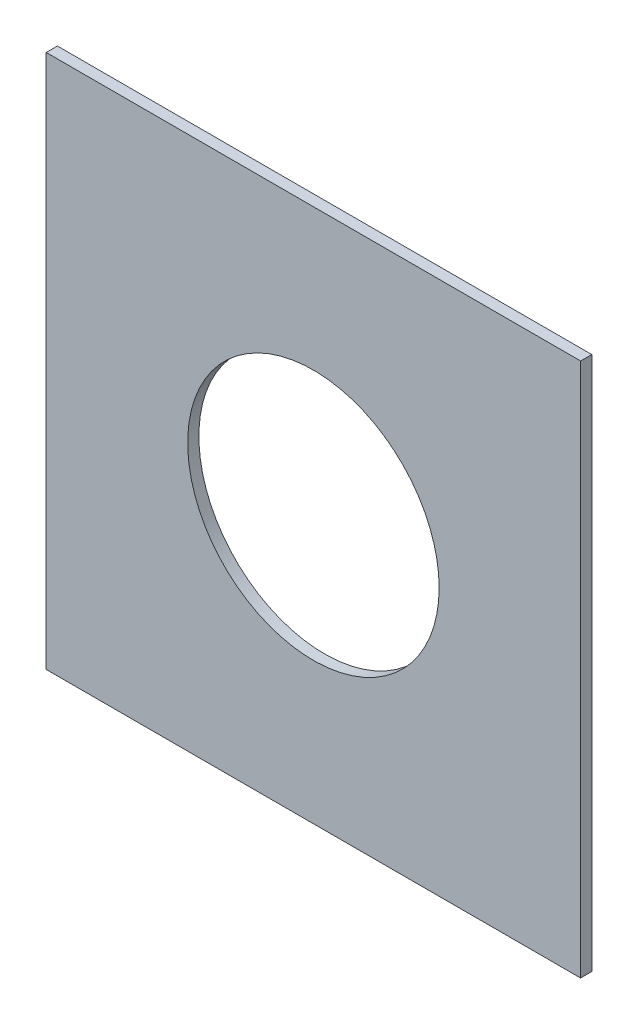
ISO-10303-21;
HEADER;
FILE_DESCRIPTION(('STEP AP214'),'2;1');
FILE_NAME('part.step','',(''),(''),'','','');
FILE_SCHEMA(('AUTOMOTIVE_DESIGN { 1 0 10303 214 1 1 1 1 }'));
ENDSEC;
DATA;
#1=APPLICATION_CONTEXT('core data for automotive mechanical design processes');
#2=APPLICATION_PROTOCOL_DEFINITION('international standard','automotive_design',2000,#1);
#3=PRODUCT_CONTEXT('',#1,'mechanical');
#4=PRODUCT('Part','Part','',(#3));
#5=PRODUCT_RELATED_PRODUCT_CATEGORY('part','',(#4));
#6=PRODUCT_DEFINITION_FORMATION('','',#4);
#7=PRODUCT_DEFINITION_CONTEXT('part definition',#1,'design');
#8=PRODUCT_DEFINITION('design','',#6,#7);
#9=PRODUCT_DEFINITION_SHAPE('','',#8);
#10=(LENGTH_UNIT() NAMED_UNIT(*) SI_UNIT(.MILLI.,.METRE.));
#11=(NAMED_UNIT(*) PLANE_ANGLE_UNIT() SI_UNIT($,.RADIAN.));
#12=(NAMED_UNIT(*) SI_UNIT($,.STERADIAN.) SOLID_ANGLE_UNIT());
#13=UNCERTAINTY_MEASURE_WITH_UNIT(LENGTH_MEASURE(1.E-05),#10,'distance_accuracy_value','');
#14=(GEOMETRIC_REPRESENTATION_CONTEXT(3) GLOBAL_UNCERTAINTY_ASSIGNED_CONTEXT((#13)) GLOBAL_UNIT_ASSIGNED_CONTEXT((#10,
#11,#12)) REPRESENTATION_CONTEXT('',''));
#15=CARTESIAN_POINT('',(0.,0.,0.));
#16=DIRECTION('',(0.,0.,1.));
#17=DIRECTION('',(1.,0.,0.));
#18=AXIS2_PLACEMENT_3D('',#15,#16,#17);
#19=CARTESIAN_POINT('',(67.629997253418,91.4300003051758,0.));
#20=DIRECTION('',(0.,-1.,0.));
#21=DIRECTION('',(-1.,0.,0.));
#22=AXIS2_PLACEMENT_3D('',#19,#20,#21);
#23=PLANE('',#22);
#24=DIRECTION('',(-1.,0.,0.));
#25=VECTOR('',#24,1.);
#26=CARTESIAN_POINT('',(67.629997253418,91.4300003051758,0.03556));
#27=LINE('',#26,#25);
#28=CARTESIAN_POINT('',(67.629997253418,91.4300003051758,0.03556));
#29=VERTEX_POINT('',#28);
#30=CARTESIAN_POINT('',(65.9300003051758,91.4300003051758,0.03556));
#31=VERTEX_POINT('',#30);
#32=EDGE_CURVE('E11',#29,#31,#27,.T.);
#33=ORIENTED_EDGE('',*,*,#32,.F.);
#34=DIRECTION('',(0.,0.,1.));
#35=VECTOR('',#34,1.);
#36=CARTESIAN_POINT('',(67.629997253418,91.4300003051758,0.));
#37=LINE('',#36,#35);
#38=CARTESIAN_POINT('',(67.629997253418,91.4300003051758,0.));
#39=VERTEX_POINT('',#38);
#40=EDGE_CURVE('E24',#39,#29,#37,.T.);
#41=ORIENTED_EDGE('',*,*,#40,.F.);
#42=DIRECTION('',(-1.,0.,0.));
#43=VECTOR('',#42,1.);
#44=CARTESIAN_POINT('',(67.629997253418,91.4300003051758,0.));
#45=LINE('',#44,#43);
#46=CARTESIAN_POINT('',(65.9300003051758,91.4300003051758,0.));
#47=VERTEX_POINT('',#46);
#48=EDGE_CURVE('E96',#39,#47,#45,.T.);
#49=ORIENTED_EDGE('',*,*,#48,.T.);
#50=DIRECTION('',(0.,0.,1.));
#51=VECTOR('',#50,1.);
#52=CARTESIAN_POINT('',(65.9300003051758,91.4300003051758,0.));
#53=LINE('',#52,#51);
#54=EDGE_CURVE('E37',#47,#31,#53,.T.);
#55=ORIENTED_EDGE('',*,*,#54,.T.);
#56=EDGE_LOOP('',(#33,#41,#49,#55));
#57=FACE_BOUND('',#56,.T.);
#58=ADVANCED_FACE('F17',(#57),#23,.F.);
#59=CARTESIAN_POINT('',(65.9300003051758,91.4300003051758,0.));
#60=DIRECTION('',(1.,0.,0.));
#61=DIRECTION('',(0.,-1.,0.));
#62=AXIS2_PLACEMENT_3D('',#59,#60,#61);
#63=PLANE('',#62);
#64=DIRECTION('',(0.,-1.,0.));
#65=VECTOR('',#64,1.);
#66=CARTESIAN_POINT('',(65.9300003051758,91.4300003051758,0.03556));
#67=LINE('',#66,#65);
#68=CARTESIAN_POINT('',(65.9300003051758,89.7300033569336,0.03556));
#69=VERTEX_POINT('',#68);
#70=EDGE_CURVE('E92',#31,#69,#67,.T.);
#71=ORIENTED_EDGE('',*,*,#70,.F.);
#72=ORIENTED_EDGE('',*,*,#54,.F.);
#73=DIRECTION('',(0.,-1.,0.));
#74=VECTOR('',#73,1.);
#75=CARTESIAN_POINT('',(65.9300003051758,91.4300003051758,0.));
#76=LINE('',#75,#74);
#77=CARTESIAN_POINT('',(65.9300003051758,89.7300033569336,0.));
#78=VERTEX_POINT('',#77);
#79=EDGE_CURVE('E89',#47,#78,#76,.T.);
#80=ORIENTED_EDGE('',*,*,#79,.T.);
#81=DIRECTION('',(0.,0.,1.));
#82=VECTOR('',#81,1.);
#83=CARTESIAN_POINT('',(65.9300003051758,89.7300033569336,0.));
#84=LINE('',#83,#82);
#85=EDGE_CURVE('E87',#78,#69,#84,.T.);
#86=ORIENTED_EDGE('',*,*,#85,.T.);
#87=EDGE_LOOP('',(#71,#72,#80,#86));
#88=FACE_BOUND('',#87,.T.);
#89=ADVANCED_FACE('F104',(#88),#63,.F.);
#90=CARTESIAN_POINT('',(65.9300003051758,89.7300033569336,0.));
#91=DIRECTION('',(0.,1.,0.));
#92=DIRECTION('',(1.,0.,0.));
#93=AXIS2_PLACEMENT_3D('',#90,#91,#92);
#94=PLANE('',#93);
#95=DIRECTION('',(1.,0.,0.));
#96=VECTOR('',#95,1.);
#97=CARTESIAN_POINT('',(65.9300003051758,89.7300033569336,0.03556));
#98=LINE('',#97,#96);
#99=CARTESIAN_POINT('',(67.629997253418,89.7300033569336,0.03556));
#100=VERTEX_POINT('',#99);
#101=EDGE_CURVE('E84',#69,#100,#98,.T.);
#102=ORIENTED_EDGE('',*,*,#101,.F.);
#103=ORIENTED_EDGE('',*,*,#85,.F.);
#104=DIRECTION('',(1.,0.,0.));
#105=VECTOR('',#104,1.);
#106=CARTESIAN_POINT('',(65.9300003051758,89.7300033569336,0.));
#107=LINE('',#106,#105);
#108=CARTESIAN_POINT('',(67.629997253418,89.7300033569336,0.));
#109=VERTEX_POINT('',#108);
#110=EDGE_CURVE('E81',#78,#109,#107,.T.);
#111=ORIENTED_EDGE('',*,*,#110,.T.);
#112=DIRECTION('',(0.,0.,1.));
#113=VECTOR('',#112,1.);
#114=CARTESIAN_POINT('',(67.629997253418,89.7300033569336,0.));
#115=LINE('',#114,#113);
#116=EDGE_CURVE('E79',#109,#100,#115,.T.);
#117=ORIENTED_EDGE('',*,*,#116,.T.);
#118=EDGE_LOOP('',(#102,#103,#111,#117));
#119=FACE_BOUND('',#118,.T.);
#120=ADVANCED_FACE('F110',(#119),#94,.F.);
#121=CARTESIAN_POINT('',(67.629997253418,89.7300033569336,0.));
#122=DIRECTION('',(-1.,0.,0.));
#123=DIRECTION('',(0.,1.,0.));
#124=AXIS2_PLACEMENT_3D('',#121,#122,#123);
#125=PLANE('',#124);
#126=DIRECTION('',(0.,1.,0.));
#127=VECTOR('',#126,1.);
#128=CARTESIAN_POINT('',(67.629997253418,89.7300033569336,0.03556));
#129=LINE('',#128,#127);
#130=EDGE_CURVE('E76',#100,#29,#129,.T.);
#131=ORIENTED_EDGE('',*,*,#130,.F.);
#132=ORIENTED_EDGE('',*,*,#116,.F.);
#133=DIRECTION('',(0.,1.,0.));
#134=VECTOR('',#133,1.);
#135=CARTESIAN_POINT('',(67.629997253418,89.7300033569336,0.));
#136=LINE('',#135,#134);
#137=EDGE_CURVE('E68',#109,#39,#136,.T.);
#138=ORIENTED_EDGE('',*,*,#137,.T.);
#139=ORIENTED_EDGE('',*,*,#40,.T.);
#140=EDGE_LOOP('',(#131,#132,#138,#139));
#141=FACE_BOUND('',#140,.T.);
#142=ADVANCED_FACE('F111',(#141),#125,.F.);
#143=CARTESIAN_POINT('',(66.7800036,90.5800068,0.));
#144=DIRECTION('',(0.,0.,-1.));
#145=DIRECTION('',(1.,0.,0.));
#146=AXIS2_PLACEMENT_3D('',#143,#144,#145);
#147=CYLINDRICAL_SURFACE('',#146,0.3999992);
#148=DIRECTION('',(0.,0.,1.));
#149=VECTOR('',#148,1.);
#150=CARTESIAN_POINT('',(67.1800028,90.5800068,0.));
#151=LINE('',#150,#149);
#152=CARTESIAN_POINT('',(67.1800028,90.5800068,0.));
#153=VERTEX_POINT('',#152);
#154=CARTESIAN_POINT('',(67.1800028,90.5800068,0.03556));
#155=VERTEX_POINT('',#154);
#156=EDGE_CURVE('E62',#153,#155,#151,.T.);
#157=ORIENTED_EDGE('',*,*,#156,.T.);
#158=CARTESIAN_POINT('',(66.7800036,90.5800068,0.03556));
#159=DIRECTION('',(0.,0.,1.));
#160=DIRECTION('',(1.,0.,0.));
#161=AXIS2_PLACEMENT_3D('',#158,#159,#160);
#162=CIRCLE('',#161,0.3999992);
#163=EDGE_CURVE('E67',#155,#155,#162,.T.);
#164=ORIENTED_EDGE('',*,*,#163,.T.);
#165=ORIENTED_EDGE('',*,*,#156,.F.);
#166=CARTESIAN_POINT('',(66.7800036,90.5800068,0.));
#167=DIRECTION('',(0.,0.,1.));
#168=DIRECTION('',(1.,0.,0.));
#169=AXIS2_PLACEMENT_3D('',#166,#167,#168);
#170=CIRCLE('',#169,0.3999992);
#171=EDGE_CURVE('E65',#153,#153,#170,.T.);
#172=ORIENTED_EDGE('',*,*,#171,.F.);
#173=EDGE_LOOP('',(#157,#164,#165,#172));
#174=FACE_BOUND('',#173,.T.);
#175=ADVANCED_FACE('F64',(#174),#147,.F.);
#176=CARTESIAN_POINT('',(67.629997253418,91.4300003051758,0.));
#177=DIRECTION('',(0.,0.,-1.));
#178=DIRECTION('',(-1.,0.,0.));
#179=AXIS2_PLACEMENT_3D('',#176,#177,#178);
#180=PLANE('',#179);
#181=ORIENTED_EDGE('',*,*,#137,.F.);
#182=ORIENTED_EDGE('',*,*,#110,.F.);
#183=ORIENTED_EDGE('',*,*,#79,.F.);
#184=ORIENTED_EDGE('',*,*,#48,.F.);
#185=EDGE_LOOP('',(#181,#182,#183,#184));
#186=FACE_BOUND('',#185,.T.);
#187=ORIENTED_EDGE('',*,*,#171,.T.);
#188=EDGE_LOOP('',(#187));
#189=FACE_BOUND('',#188,.T.);
#190=ADVANCED_FACE('F71',(#186,#189),#180,.T.);
#191=CARTESIAN_POINT('',(67.629997253418,91.4300003051758,0.03556));
#192=DIRECTION('',(0.,0.,-1.));
#193=DIRECTION('',(-1.,0.,0.));
#194=AXIS2_PLACEMENT_3D('',#191,#192,#193);
#195=PLANE('',#194);
#196=ORIENTED_EDGE('',*,*,#32,.T.);
#197=ORIENTED_EDGE('',*,*,#70,.T.);
#198=ORIENTED_EDGE('',*,*,#101,.T.);
#199=ORIENTED_EDGE('',*,*,#130,.T.);
#200=EDGE_LOOP('',(#196,#197,#198,#199));
#201=FACE_BOUND('',#200,.T.);
#202=ORIENTED_EDGE('',*,*,#163,.F.);
#203=EDGE_LOOP('',(#202));
#204=FACE_BOUND('',#203,.T.);
#205=ADVANCED_FACE('F107',(#201,#204),#195,.F.);
#206=CLOSED_SHELL('',(#58,#89,#120,#142,#175,#190,#205));
#207=MANIFOLD_SOLID_BREP('B1',#206);
#208=ADVANCED_BREP_SHAPE_REPRESENTATION('',(#18,#207),#14);
#209=SHAPE_DEFINITION_REPRESENTATION(#9,#208);
ENDSEC;
END-ISO-10303-21;
